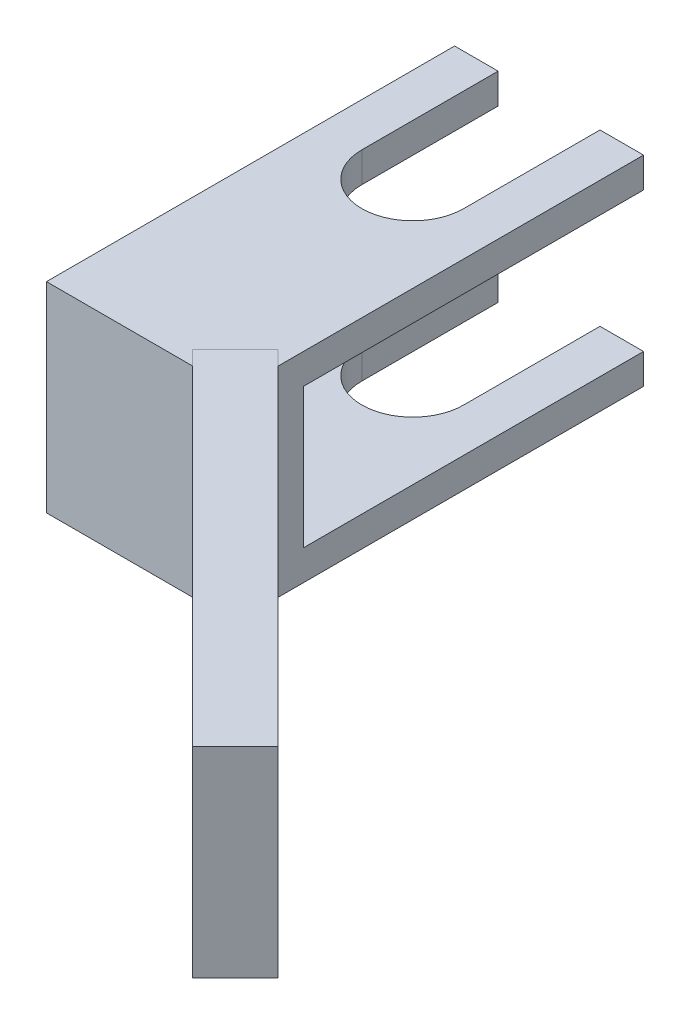
ISO-10303-21;
HEADER;
FILE_DESCRIPTION(('STEP AP214'),'2;1');
FILE_NAME('part.step','',(''),(''),'','','');
FILE_SCHEMA(('AUTOMOTIVE_DESIGN { 1 0 10303 214 1 1 1 1 }'));
ENDSEC;
DATA;
#1=APPLICATION_CONTEXT('core data for automotive mechanical design processes');
#2=APPLICATION_PROTOCOL_DEFINITION('international standard','automotive_design',2000,#1);
#3=PRODUCT_CONTEXT('',#1,'mechanical');
#4=PRODUCT('Part','Part','',(#3));
#5=PRODUCT_RELATED_PRODUCT_CATEGORY('part','',(#4));
#6=PRODUCT_DEFINITION_FORMATION('','',#4);
#7=PRODUCT_DEFINITION_CONTEXT('part definition',#1,'design');
#8=PRODUCT_DEFINITION('design','',#6,#7);
#9=PRODUCT_DEFINITION_SHAPE('','',#8);
#10=(LENGTH_UNIT() NAMED_UNIT(*) SI_UNIT(.MILLI.,.METRE.));
#11=(NAMED_UNIT(*) PLANE_ANGLE_UNIT() SI_UNIT($,.RADIAN.));
#12=(NAMED_UNIT(*) SI_UNIT($,.STERADIAN.) SOLID_ANGLE_UNIT());
#13=UNCERTAINTY_MEASURE_WITH_UNIT(LENGTH_MEASURE(1.E-05),#10,'distance_accuracy_value','');
#14=(GEOMETRIC_REPRESENTATION_CONTEXT(3) GLOBAL_UNCERTAINTY_ASSIGNED_CONTEXT((#13)) GLOBAL_UNIT_ASSIGNED_CONTEXT((#10,
#11,#12)) REPRESENTATION_CONTEXT('',''));
#15=CARTESIAN_POINT('',(0.,0.,0.));
#16=DIRECTION('',(0.,0.,1.));
#17=DIRECTION('',(1.,0.,0.));
#18=AXIS2_PLACEMENT_3D('',#15,#16,#17);
#19=CARTESIAN_POINT('',(34.9307106480413,0.,4.24441914702606));
#20=DIRECTION('',(-0.707106781186548,0.,-0.707106781186547));
#21=DIRECTION('',(-0.707106781186547,0.,0.707106781186548));
#22=AXIS2_PLACEMENT_3D('',#19,#20,#21);
#23=PLANE('',#22);
#24=DIRECTION('',(0.707106781186547,0.,-0.707106781186548));
#25=VECTOR('',#24,1.);
#26=CARTESIAN_POINT('',(34.9307106480413,53.,4.24441914702606));
#27=LINE('',#26,#25);
#28=CARTESIAN_POINT('',(34.9307106480413,53.,4.24441914702606));
#29=VERTEX_POINT('',#28);
#30=CARTESIAN_POINT('',(46.2444191470261,53.,-7.0692893519587));
#31=VERTEX_POINT('',#30);
#32=EDGE_CURVE('E46',#29,#31,#27,.T.);
#33=ORIENTED_EDGE('',*,*,#32,.T.);
#34=DIRECTION('',(0.,1.,0.));
#35=VECTOR('',#34,1.);
#36=CARTESIAN_POINT('',(46.2444191470261,0.,-7.0692893519587));
#37=LINE('',#36,#35);
#38=CARTESIAN_POINT('',(46.2444191470261,0.,-7.0692893519587));
#39=VERTEX_POINT('',#38);
#40=EDGE_CURVE('E83',#39,#31,#37,.T.);
#41=ORIENTED_EDGE('',*,*,#40,.F.);
#42=DIRECTION('',(0.707106781186547,0.,-0.707106781186548));
#43=VECTOR('',#42,1.);
#44=CARTESIAN_POINT('',(34.9307106480413,0.,4.24441914702606));
#45=LINE('',#44,#43);
#46=CARTESIAN_POINT('',(34.9307106480413,0.,4.24441914702606));
#47=VERTEX_POINT('',#46);
#48=EDGE_CURVE('E12',#47,#39,#45,.T.);
#49=ORIENTED_EDGE('',*,*,#48,.F.);
#50=DIRECTION('',(0.,1.,0.));
#51=VECTOR('',#50,1.);
#52=CARTESIAN_POINT('',(34.9307106480413,0.,4.24441914702606));
#53=LINE('',#52,#51);
#54=EDGE_CURVE('E84',#47,#29,#53,.T.);
#55=ORIENTED_EDGE('',*,*,#54,.T.);
#56=EDGE_LOOP('',(#33,#41,#49,#55));
#57=FACE_BOUND('',#56,.T.);
#58=ADVANCED_FACE('F43',(#57),#23,.T.);
#59=CARTESIAN_POINT('',(34.9307106480413,0.,4.24441914702606));
#60=DIRECTION('',(0.,-1.,0.));
#61=DIRECTION('',(0.,0.,-1.));
#62=AXIS2_PLACEMENT_3D('',#59,#60,#61);
#63=PLANE('',#62);
#64=ORIENTED_EDGE('',*,*,#48,.T.);
#65=DIRECTION('',(-0.707106781186547,0.,-0.707106781186547));
#66=VECTOR('',#65,1.);
#67=CARTESIAN_POINT('',(46.2444191470261,0.,-7.0692893519587));
#68=LINE('',#67,#66);
#69=CARTESIAN_POINT('',(137.245815270137,0.,83.9321067711522));
#70=VERTEX_POINT('',#69);
#71=EDGE_CURVE('E100',#70,#39,#68,.T.);
#72=ORIENTED_EDGE('',*,*,#71,.F.);
#73=DIRECTION('',(0.707106781186547,0.,-0.707106781186548));
#74=VECTOR('',#73,1.);
#75=CARTESIAN_POINT('',(125.932106771152,0.,95.245815270137));
#76=LINE('',#75,#74);
#77=CARTESIAN_POINT('',(125.932106771152,0.,95.245815270137));
#78=VERTEX_POINT('',#77);
#79=EDGE_CURVE('E51',#78,#70,#76,.T.);
#80=ORIENTED_EDGE('',*,*,#79,.F.);
#81=DIRECTION('',(-0.707106781186547,0.,-0.707106781186547));
#82=VECTOR('',#81,1.);
#83=CARTESIAN_POINT('',(34.9307106480413,0.,4.24441914702606));
#84=LINE('',#83,#82);
#85=EDGE_CURVE('E89',#78,#47,#84,.T.);
#86=ORIENTED_EDGE('',*,*,#85,.T.);
#87=EDGE_LOOP('',(#64,#72,#80,#86));
#88=FACE_BOUND('',#87,.T.);
#89=ADVANCED_FACE('F115',(#88),#63,.T.);
#90=CARTESIAN_POINT('',(125.932106771152,0.,95.245815270137));
#91=DIRECTION('',(0.707106781186548,0.,0.707106781186547));
#92=DIRECTION('',(0.707106781186547,0.,-0.707106781186548));
#93=AXIS2_PLACEMENT_3D('',#90,#91,#92);
#94=PLANE('',#93);
#95=ORIENTED_EDGE('',*,*,#79,.T.);
#96=DIRECTION('',(0.,-1.,0.));
#97=VECTOR('',#96,1.);
#98=CARTESIAN_POINT('',(137.245815270137,0.,83.9321067711522));
#99=LINE('',#98,#97);
#100=CARTESIAN_POINT('',(137.245815270137,53.,83.9321067711522));
#101=VERTEX_POINT('',#100);
#102=EDGE_CURVE('E96',#101,#70,#99,.T.);
#103=ORIENTED_EDGE('',*,*,#102,.F.);
#104=DIRECTION('',(0.707106781186547,0.,-0.707106781186548));
#105=VECTOR('',#104,1.);
#106=CARTESIAN_POINT('',(125.932106771152,53.,95.245815270137));
#107=LINE('',#106,#105);
#108=CARTESIAN_POINT('',(125.932106771152,53.,95.245815270137));
#109=VERTEX_POINT('',#108);
#110=EDGE_CURVE('E88',#109,#101,#107,.T.);
#111=ORIENTED_EDGE('',*,*,#110,.F.);
#112=DIRECTION('',(0.,-1.,0.));
#113=VECTOR('',#112,1.);
#114=CARTESIAN_POINT('',(125.932106771152,0.,95.245815270137));
#115=LINE('',#114,#113);
#116=EDGE_CURVE('E108',#109,#78,#115,.T.);
#117=ORIENTED_EDGE('',*,*,#116,.T.);
#118=EDGE_LOOP('',(#95,#103,#111,#117));
#119=FACE_BOUND('',#118,.T.);
#120=ADVANCED_FACE('F112',(#119),#94,.T.);
#121=CARTESIAN_POINT('',(34.9307106480413,53.,4.24441914702606));
#122=DIRECTION('',(0.,1.,0.));
#123=DIRECTION('',(0.,0.,1.));
#124=AXIS2_PLACEMENT_3D('',#121,#122,#123);
#125=PLANE('',#124);
#126=ORIENTED_EDGE('',*,*,#110,.T.);
#127=DIRECTION('',(0.707106781186547,0.,0.707106781186547));
#128=VECTOR('',#127,1.);
#129=CARTESIAN_POINT('',(46.2444191470261,53.,-7.0692893519587));
#130=LINE('',#129,#128);
#131=EDGE_CURVE('E91',#31,#101,#130,.T.);
#132=ORIENTED_EDGE('',*,*,#131,.F.);
#133=ORIENTED_EDGE('',*,*,#32,.F.);
#134=DIRECTION('',(0.707106781186547,0.,0.707106781186547));
#135=VECTOR('',#134,1.);
#136=CARTESIAN_POINT('',(34.9307106480413,53.,4.24441914702606));
#137=LINE('',#136,#135);
#138=EDGE_CURVE('E106',#29,#109,#137,.T.);
#139=ORIENTED_EDGE('',*,*,#138,.T.);
#140=EDGE_LOOP('',(#126,#132,#133,#139));
#141=FACE_BOUND('',#140,.T.);
#142=ADVANCED_FACE('F92',(#141),#125,.T.);
#143=CARTESIAN_POINT('',(15.3431457505076,0.,-15.3431457505076));
#144=DIRECTION('',(0.707106781186547,0.,-0.707106781186547));
#145=DIRECTION('',(-0.707106781186548,0.,-0.707106781186548));
#146=AXIS2_PLACEMENT_3D('',#143,#144,#145);
#147=PLANE('',#146);
#148=ORIENTED_EDGE('',*,*,#54,.F.);
#149=ORIENTED_EDGE('',*,*,#85,.F.);
#150=ORIENTED_EDGE('',*,*,#116,.F.);
#151=ORIENTED_EDGE('',*,*,#138,.F.);
#152=EDGE_LOOP('',(#148,#149,#150,#151));
#153=FACE_BOUND('',#152,.T.);
#154=ADVANCED_FACE('F117',(#153),#147,.F.);
#155=CARTESIAN_POINT('',(26.6568542494924,0.,-26.6568542494924));
#156=DIRECTION('',(0.707106781186547,0.,-0.707106781186547));
#157=DIRECTION('',(-0.707106781186548,0.,-0.707106781186548));
#158=AXIS2_PLACEMENT_3D('',#155,#156,#157);
#159=PLANE('',#158);
#160=ORIENTED_EDGE('',*,*,#40,.T.);
#161=ORIENTED_EDGE('',*,*,#131,.T.);
#162=ORIENTED_EDGE('',*,*,#102,.T.);
#163=ORIENTED_EDGE('',*,*,#71,.T.);
#164=EDGE_LOOP('',(#160,#161,#162,#163));
#165=FACE_BOUND('',#164,.T.);
#166=ADVANCED_FACE('F99',(#165),#159,.T.);
#167=CLOSED_SHELL('',(#58,#89,#120,#142,#154,#166));
#168=MANIFOLD_SOLID_BREP('B2',#167);
#169=CARTESIAN_POINT('',(0.,8.,-100.));
#170=DIRECTION('',(0.,0.,1.));
#171=DIRECTION('',(1.,0.,0.));
#172=AXIS2_PLACEMENT_3D('',#169,#170,#171);
#173=PLANE('',#172);
#174=DIRECTION('',(-1.,0.,0.));
#175=VECTOR('',#174,1.);
#176=CARTESIAN_POINT('',(0.,8.,-100.));
#177=LINE('',#176,#175);
#178=CARTESIAN_POINT('',(11.5204483572271,8.,-100.));
#179=VERTEX_POINT('',#178);
#180=CARTESIAN_POINT('',(0.,8.,-100.));
#181=VERTEX_POINT('',#180);
#182=EDGE_CURVE('E414',#179,#181,#177,.T.);
#183=ORIENTED_EDGE('',*,*,#182,.F.);
#184=DIRECTION('',(0.,-1.,0.));
#185=VECTOR('',#184,1.);
#186=CARTESIAN_POINT('',(11.5204483572271,8.,-100.));
#187=LINE('',#186,#185);
#188=CARTESIAN_POINT('',(11.5204483572271,0.,-100.));
#189=VERTEX_POINT('',#188);
#190=EDGE_CURVE('E404',#179,#189,#187,.T.);
#191=ORIENTED_EDGE('',*,*,#190,.T.);
#192=DIRECTION('',(-1.,0.,0.));
#193=VECTOR('',#192,1.);
#194=CARTESIAN_POINT('',(0.,0.,-100.));
#195=LINE('',#194,#193);
#196=CARTESIAN_POINT('',(0.,0.,-100.));
#197=VERTEX_POINT('',#196);
#198=EDGE_CURVE('E422',#189,#197,#195,.T.);
#199=ORIENTED_EDGE('',*,*,#198,.T.);
#200=DIRECTION('',(0.,-1.,0.));
#201=VECTOR('',#200,1.);
#202=CARTESIAN_POINT('',(0.,8.,-100.));
#203=LINE('',#202,#201);
#204=EDGE_CURVE('E418',#181,#197,#203,.T.);
#205=ORIENTED_EDGE('',*,*,#204,.F.);
#206=EDGE_LOOP('',(#183,#191,#199,#205));
#207=FACE_BOUND('',#206,.T.);
#208=ADVANCED_FACE('F167',(#207),#173,.F.);
#209=CARTESIAN_POINT('',(0.,8.,0.));
#210=DIRECTION('',(1.,0.,0.));
#211=DIRECTION('',(0.,0.,-1.));
#212=AXIS2_PLACEMENT_3D('',#209,#210,#211);
#213=PLANE('',#212);
#214=DIRECTION('',(0.,-1.,0.));
#215=VECTOR('',#214,1.);
#216=CARTESIAN_POINT('',(0.,0.,8.));
#217=LINE('',#216,#215);
#218=CARTESIAN_POINT('',(0.,53.,8.));
#219=VERTEX_POINT('',#218);
#220=CARTESIAN_POINT('',(0.,0.,8.));
#221=VERTEX_POINT('',#220);
#222=EDGE_CURVE('E354',#219,#221,#217,.T.);
#223=ORIENTED_EDGE('',*,*,#222,.F.);
#224=DIRECTION('',(0.,0.,1.));
#225=VECTOR('',#224,1.);
#226=CARTESIAN_POINT('',(0.,53.,-10.));
#227=LINE('',#226,#225);
#228=CARTESIAN_POINT('',(0.,53.,-100.));
#229=VERTEX_POINT('',#228);
#230=EDGE_CURVE('E370',#229,#219,#227,.T.);
#231=ORIENTED_EDGE('',*,*,#230,.F.);
#232=DIRECTION('',(0.,-1.,0.));
#233=VECTOR('',#232,1.);
#234=CARTESIAN_POINT('',(0.,53.,-100.));
#235=LINE('',#234,#233);
#236=CARTESIAN_POINT('',(0.,45.,-100.));
#237=VERTEX_POINT('',#236);
#238=EDGE_CURVE('E338',#229,#237,#235,.T.);
#239=ORIENTED_EDGE('',*,*,#238,.T.);
#240=DIRECTION('',(0.,0.,1.));
#241=VECTOR('',#240,1.);
#242=CARTESIAN_POINT('',(0.,45.,0.));
#243=LINE('',#242,#241);
#244=CARTESIAN_POINT('',(0.,45.,-10.));
#245=VERTEX_POINT('',#244);
#246=EDGE_CURVE('E334',#237,#245,#243,.T.);
#247=ORIENTED_EDGE('',*,*,#246,.T.);
#248=DIRECTION('',(0.,-1.,0.));
#249=VECTOR('',#248,1.);
#250=CARTESIAN_POINT('',(0.,0.,-10.));
#251=LINE('',#250,#249);
#252=CARTESIAN_POINT('',(0.,8.,-10.));
#253=VERTEX_POINT('',#252);
#254=EDGE_CURVE('E366',#245,#253,#251,.T.);
#255=ORIENTED_EDGE('',*,*,#254,.T.);
#256=DIRECTION('',(0.,0.,1.));
#257=VECTOR('',#256,1.);
#258=CARTESIAN_POINT('',(0.,8.,0.));
#259=LINE('',#258,#257);
#260=EDGE_CURVE('E408',#181,#253,#259,.T.);
#261=ORIENTED_EDGE('',*,*,#260,.F.);
#262=ORIENTED_EDGE('',*,*,#204,.T.);
#263=DIRECTION('',(0.,0.,1.));
#264=VECTOR('',#263,1.);
#265=CARTESIAN_POINT('',(0.,0.,0.));
#266=LINE('',#265,#264);
#267=EDGE_CURVE('E407',#197,#221,#266,.T.);
#268=ORIENTED_EDGE('',*,*,#267,.T.);
#269=EDGE_LOOP('',(#223,#231,#239,#247,#255,#261,#262,#268));
#270=FACE_BOUND('',#269,.T.);
#271=ADVANCED_FACE('F169',(#270),#213,.F.);
#272=CARTESIAN_POINT('',(50.,8.,0.));
#273=DIRECTION('',(-1.,0.,0.));
#274=DIRECTION('',(0.,0.,1.));
#275=AXIS2_PLACEMENT_3D('',#272,#273,#274);
#276=PLANE('',#275);
#277=DIRECTION('',(0.,0.,1.));
#278=VECTOR('',#277,1.);
#279=CARTESIAN_POINT('',(50.,53.,-10.));
#280=LINE('',#279,#278);
#281=CARTESIAN_POINT('',(50.,53.,-100.));
#282=VERTEX_POINT('',#281);
#283=CARTESIAN_POINT('',(50.,53.,8.));
#284=VERTEX_POINT('',#283);
#285=EDGE_CURVE('E369',#282,#284,#280,.T.);
#286=ORIENTED_EDGE('',*,*,#285,.T.);
#287=DIRECTION('',(0.,1.,0.));
#288=VECTOR('',#287,1.);
#289=CARTESIAN_POINT('',(50.,0.,8.));
#290=LINE('',#289,#288);
#291=CARTESIAN_POINT('',(50.,0.,8.));
#292=VERTEX_POINT('',#291);
#293=EDGE_CURVE('E360',#292,#284,#290,.T.);
#294=ORIENTED_EDGE('',*,*,#293,.F.);
#295=DIRECTION('',(0.,0.,-1.));
#296=VECTOR('',#295,1.);
#297=CARTESIAN_POINT('',(50.,0.,0.));
#298=LINE('',#297,#296);
#299=CARTESIAN_POINT('',(50.,0.,-100.));
#300=VERTEX_POINT('',#299);
#301=EDGE_CURVE('E420',#292,#300,#298,.T.);
#302=ORIENTED_EDGE('',*,*,#301,.T.);
#303=DIRECTION('',(0.,-1.,0.));
#304=VECTOR('',#303,1.);
#305=CARTESIAN_POINT('',(50.,8.,-100.));
#306=LINE('',#305,#304);
#307=CARTESIAN_POINT('',(50.,8.,-100.));
#308=VERTEX_POINT('',#307);
#309=EDGE_CURVE('E427',#308,#300,#306,.T.);
#310=ORIENTED_EDGE('',*,*,#309,.F.);
#311=DIRECTION('',(0.,0.,-1.));
#312=VECTOR('',#311,1.);
#313=CARTESIAN_POINT('',(50.,8.,0.));
#314=LINE('',#313,#312);
#315=CARTESIAN_POINT('',(50.,8.,-10.));
#316=VERTEX_POINT('',#315);
#317=EDGE_CURVE('E411',#316,#308,#314,.T.);
#318=ORIENTED_EDGE('',*,*,#317,.F.);
#319=DIRECTION('',(0.,1.,0.));
#320=VECTOR('',#319,1.);
#321=CARTESIAN_POINT('',(50.,0.,-10.));
#322=LINE('',#321,#320);
#323=CARTESIAN_POINT('',(50.,45.,-10.));
#324=VERTEX_POINT('',#323);
#325=EDGE_CURVE('E184',#316,#324,#322,.T.);
#326=ORIENTED_EDGE('',*,*,#325,.T.);
#327=DIRECTION('',(0.,0.,-1.));
#328=VECTOR('',#327,1.);
#329=CARTESIAN_POINT('',(50.,45.,0.));
#330=LINE('',#329,#328);
#331=CARTESIAN_POINT('',(50.,45.,-100.));
#332=VERTEX_POINT('',#331);
#333=EDGE_CURVE('E342',#324,#332,#330,.T.);
#334=ORIENTED_EDGE('',*,*,#333,.T.);
#335=DIRECTION('',(0.,-1.,0.));
#336=VECTOR('',#335,1.);
#337=CARTESIAN_POINT('',(50.,53.,-100.));
#338=LINE('',#337,#336);
#339=EDGE_CURVE('E350',#282,#332,#338,.T.);
#340=ORIENTED_EDGE('',*,*,#339,.F.);
#341=EDGE_LOOP('',(#286,#294,#302,#310,#318,#326,#334,#340));
#342=FACE_BOUND('',#341,.T.);
#343=ADVANCED_FACE('F465',(#342),#276,.F.);
#344=CARTESIAN_POINT('',(38.479551592322,0.,-100.));
#345=VERTEX_POINT('',#344);
#346=EDGE_CURVE('E412',#300,#345,#195,.T.);
#347=ORIENTED_EDGE('',*,*,#346,.T.);
#348=DIRECTION('',(0.,1.,0.));
#349=VECTOR('',#348,1.);
#350=CARTESIAN_POINT('',(38.479551592322,0.,-100.));
#351=LINE('',#350,#349);
#352=CARTESIAN_POINT('',(38.479551592322,8.,-100.));
#353=VERTEX_POINT('',#352);
#354=EDGE_CURVE('E398',#345,#353,#351,.T.);
#355=ORIENTED_EDGE('',*,*,#354,.T.);
#356=EDGE_CURVE('E415',#308,#353,#177,.T.);
#357=ORIENTED_EDGE('',*,*,#356,.F.);
#358=ORIENTED_EDGE('',*,*,#309,.T.);
#359=EDGE_LOOP('',(#347,#355,#357,#358));
#360=FACE_BOUND('',#359,.T.);
#361=ADVANCED_FACE('F462',(#360),#173,.F.);
#362=CARTESIAN_POINT('',(0.,8.,0.));
#363=DIRECTION('',(0.,-1.,0.));
#364=DIRECTION('',(0.,0.,-1.));
#365=AXIS2_PLACEMENT_3D('',#362,#363,#364);
#366=PLANE('',#365);
#367=ORIENTED_EDGE('',*,*,#260,.T.);
#368=DIRECTION('',(1.,0.,0.));
#369=VECTOR('',#368,1.);
#370=CARTESIAN_POINT('',(0.,8.,-10.));
#371=LINE('',#370,#369);
#372=EDGE_CURVE('E372',#253,#316,#371,.T.);
#373=ORIENTED_EDGE('',*,*,#372,.T.);
#374=ORIENTED_EDGE('',*,*,#317,.T.);
#375=ORIENTED_EDGE('',*,*,#356,.T.);
#376=CARTESIAN_POINT('',(25.,8.,-100.));
#377=DIRECTION('',(0.,1.,0.));
#378=DIRECTION('',(0.,0.,1.));
#379=AXIS2_PLACEMENT_3D('',#376,#377,#378);
#380=CIRCLE('',#379,13.479551592322);
#381=CARTESIAN_POINT('',(38.4795515418711,8.,-99.9988337620739));
#382=VERTEX_POINT('',#381);
#383=EDGE_CURVE('E392',#382,#353,#380,.T.);
#384=ORIENTED_EDGE('',*,*,#383,.F.);
#385=DIRECTION('',(8.6519044650364E-05,0.,-0.999999996257227));
#386=VECTOR('',#385,1.);
#387=CARTESIAN_POINT('',(38.476431566667,8.,-63.9376959515123));
#388=LINE('',#387,#386);
#389=CARTESIAN_POINT('',(38.476431566667,8.,-63.9376959515123));
#390=VERTEX_POINT('',#389);
#391=EDGE_CURVE('E389',#390,#382,#388,.T.);
#392=ORIENTED_EDGE('',*,*,#391,.F.);
#393=CARTESIAN_POINT('',(24.9968800247959,8.,-63.9388621894383));
#394=DIRECTION('',(0.,1.,0.));
#395=DIRECTION('',(0.,0.,1.));
#396=AXIS2_PLACEMENT_3D('',#393,#394,#395);
#397=CIRCLE('',#396,13.479551592322);
#398=CARTESIAN_POINT('',(11.5173284829249,8.,-63.9400284273644));
#399=VERTEX_POINT('',#398);
#400=EDGE_CURVE('E375',#399,#390,#397,.T.);
#401=ORIENTED_EDGE('',*,*,#400,.F.);
#402=DIRECTION('',(-8.65190446501235E-05,0.,0.999999996257227));
#403=VECTOR('',#402,1.);
#404=CARTESIAN_POINT('',(11.5173284829249,8.,-63.9400284273644));
#405=LINE('',#404,#403);
#406=EDGE_CURVE('E380',#179,#399,#405,.T.);
#407=ORIENTED_EDGE('',*,*,#406,.F.);
#408=ORIENTED_EDGE('',*,*,#182,.T.);
#409=EDGE_LOOP('',(#367,#373,#374,#375,#384,#392,#401,#407,#408));
#410=FACE_BOUND('',#409,.T.);
#411=ADVANCED_FACE('F447',(#410),#366,.F.);
#412=CARTESIAN_POINT('',(0.,0.,0.));
#413=DIRECTION('',(0.,-1.,0.));
#414=DIRECTION('',(0.,0.,-1.));
#415=AXIS2_PLACEMENT_3D('',#412,#413,#414);
#416=PLANE('',#415);
#417=ORIENTED_EDGE('',*,*,#346,.F.);
#418=ORIENTED_EDGE('',*,*,#301,.F.);
#419=DIRECTION('',(1.,0.,0.));
#420=VECTOR('',#419,1.);
#421=CARTESIAN_POINT('',(0.,0.,8.));
#422=LINE('',#421,#420);
#423=EDGE_CURVE('E357',#221,#292,#422,.T.);
#424=ORIENTED_EDGE('',*,*,#423,.F.);
#425=ORIENTED_EDGE('',*,*,#267,.F.);
#426=ORIENTED_EDGE('',*,*,#198,.F.);
#427=DIRECTION('',(8.65190446501235E-05,0.,-0.999999996257227));
#428=VECTOR('',#427,1.);
#429=CARTESIAN_POINT('',(11.5117963665577,0.,0.000995989627569095));
#430=LINE('',#429,#428);
#431=CARTESIAN_POINT('',(11.5173284829249,0.,-63.9400284273644));
#432=VERTEX_POINT('',#431);
#433=EDGE_CURVE('E175',#432,#189,#430,.T.);
#434=ORIENTED_EDGE('',*,*,#433,.F.);
#435=CARTESIAN_POINT('',(24.9968800247959,0.,-63.9388621894383));
#436=DIRECTION('',(0.,1.,0.));
#437=DIRECTION('',(0.,0.,1.));
#438=AXIS2_PLACEMENT_3D('',#435,#436,#437);
#439=CIRCLE('',#438,13.479551592322);
#440=CARTESIAN_POINT('',(38.476431566667,0.,-63.9376959515123));
#441=VERTEX_POINT('',#440);
#442=EDGE_CURVE('E376',#432,#441,#439,.T.);
#443=ORIENTED_EDGE('',*,*,#442,.T.);
#444=DIRECTION('',(8.6519044650364E-05,0.,-0.999999996257227));
#445=VECTOR('',#444,1.);
#446=CARTESIAN_POINT('',(38.476431566667,0.,-63.9376959515123));
#447=LINE('',#446,#445);
#448=CARTESIAN_POINT('',(38.4795515418711,0.,-99.9988337620739));
#449=VERTEX_POINT('',#448);
#450=EDGE_CURVE('E379',#441,#449,#447,.T.);
#451=ORIENTED_EDGE('',*,*,#450,.T.);
#452=CARTESIAN_POINT('',(25.,0.,-100.));
#453=DIRECTION('',(0.,1.,0.));
#454=DIRECTION('',(0.,0.,1.));
#455=AXIS2_PLACEMENT_3D('',#452,#453,#454);
#456=CIRCLE('',#455,13.479551592322);
#457=EDGE_CURVE('E383',#449,#345,#456,.T.);
#458=ORIENTED_EDGE('',*,*,#457,.T.);
#459=EDGE_LOOP('',(#417,#418,#424,#425,#426,#434,#443,#451,#458));
#460=FACE_BOUND('',#459,.T.);
#461=ADVANCED_FACE('F441',(#460),#416,.T.);
#462=CARTESIAN_POINT('',(11.5173284829249,0.,-63.9400284273644));
#463=DIRECTION('',(-0.999999996257227,0.,-8.65190446501235E-05));
#464=DIRECTION('',(-8.65190446501235E-05,0.,0.999999996257227));
#465=AXIS2_PLACEMENT_3D('',#462,#463,#464);
#466=PLANE('',#465);
#467=ORIENTED_EDGE('',*,*,#406,.T.);
#468=DIRECTION('',(0.,1.,0.));
#469=VECTOR('',#468,1.);
#470=CARTESIAN_POINT('',(11.5173284829249,0.,-63.9400284273644));
#471=LINE('',#470,#469);
#472=EDGE_CURVE('E395',#432,#399,#471,.T.);
#473=ORIENTED_EDGE('',*,*,#472,.F.);
#474=ORIENTED_EDGE('',*,*,#433,.T.);
#475=ORIENTED_EDGE('',*,*,#190,.F.);
#476=EDGE_LOOP('',(#467,#473,#474,#475));
#477=FACE_BOUND('',#476,.T.);
#478=ADVANCED_FACE('F431',(#477),#466,.F.);
#479=CARTESIAN_POINT('',(25.,0.,-100.));
#480=DIRECTION('',(0.,1.,0.));
#481=DIRECTION('',(0.,0.,1.));
#482=AXIS2_PLACEMENT_3D('',#479,#480,#481);
#483=CYLINDRICAL_SURFACE('',#482,13.479551592322);
#484=ORIENTED_EDGE('',*,*,#457,.F.);
#485=DIRECTION('',(0.,1.,0.));
#486=VECTOR('',#485,1.);
#487=CARTESIAN_POINT('',(38.4795515418711,0.,-99.9988337620739));
#488=LINE('',#487,#486);
#489=EDGE_CURVE('E399',#449,#382,#488,.T.);
#490=ORIENTED_EDGE('',*,*,#489,.T.);
#491=ORIENTED_EDGE('',*,*,#383,.T.);
#492=ORIENTED_EDGE('',*,*,#354,.F.);
#493=EDGE_LOOP('',(#484,#490,#491,#492));
#494=FACE_BOUND('',#493,.T.);
#495=ADVANCED_FACE('F459',(#494),#483,.F.);
#496=CARTESIAN_POINT('',(24.9968800247959,0.,-63.9388621894383));
#497=DIRECTION('',(0.,1.,0.));
#498=DIRECTION('',(0.,0.,1.));
#499=AXIS2_PLACEMENT_3D('',#496,#497,#498);
#500=CYLINDRICAL_SURFACE('',#499,13.479551592322);
#501=ORIENTED_EDGE('',*,*,#400,.T.);
#502=DIRECTION('',(0.,1.,0.));
#503=VECTOR('',#502,1.);
#504=CARTESIAN_POINT('',(38.476431566667,0.,-63.9376959515123));
#505=LINE('',#504,#503);
#506=EDGE_CURVE('E386',#441,#390,#505,.T.);
#507=ORIENTED_EDGE('',*,*,#506,.F.);
#508=ORIENTED_EDGE('',*,*,#442,.F.);
#509=ORIENTED_EDGE('',*,*,#472,.T.);
#510=EDGE_LOOP('',(#501,#507,#508,#509));
#511=FACE_BOUND('',#510,.T.);
#512=ADVANCED_FACE('F452',(#511),#500,.F.);
#513=CARTESIAN_POINT('',(38.476431566667,0.,-63.9376959515123));
#514=DIRECTION('',(0.999999996257227,0.,8.6519044650364E-05));
#515=DIRECTION('',(8.6519044650364E-05,0.,-0.999999996257227));
#516=AXIS2_PLACEMENT_3D('',#513,#514,#515);
#517=PLANE('',#516);
#518=ORIENTED_EDGE('',*,*,#391,.T.);
#519=ORIENTED_EDGE('',*,*,#489,.F.);
#520=ORIENTED_EDGE('',*,*,#450,.F.);
#521=ORIENTED_EDGE('',*,*,#506,.T.);
#522=EDGE_LOOP('',(#518,#519,#520,#521));
#523=FACE_BOUND('',#522,.T.);
#524=ADVANCED_FACE('F456',(#523),#517,.F.);
#525=CARTESIAN_POINT('',(0.,0.,-10.));
#526=DIRECTION('',(0.,0.,-1.));
#527=DIRECTION('',(-1.,0.,0.));
#528=AXIS2_PLACEMENT_3D('',#525,#526,#527);
#529=PLANE('',#528);
#530=DIRECTION('',(-1.,0.,0.));
#531=VECTOR('',#530,1.);
#532=CARTESIAN_POINT('',(0.,45.,-10.));
#533=LINE('',#532,#531);
#534=EDGE_CURVE('E41',#324,#245,#533,.T.);
#535=ORIENTED_EDGE('',*,*,#534,.F.);
#536=ORIENTED_EDGE('',*,*,#325,.F.);
#537=ORIENTED_EDGE('',*,*,#372,.F.);
#538=ORIENTED_EDGE('',*,*,#254,.F.);
#539=EDGE_LOOP('',(#535,#536,#537,#538));
#540=FACE_BOUND('',#539,.T.);
#541=ADVANCED_FACE('F526',(#540),#529,.T.);
#542=CARTESIAN_POINT('',(0.,53.,-10.));
#543=DIRECTION('',(0.,1.,0.));
#544=DIRECTION('',(0.,0.,1.));
#545=AXIS2_PLACEMENT_3D('',#542,#543,#544);
#546=PLANE('',#545);
#547=ORIENTED_EDGE('',*,*,#230,.T.);
#548=DIRECTION('',(-1.,0.,0.));
#549=VECTOR('',#548,1.);
#550=CARTESIAN_POINT('',(0.,53.,8.));
#551=LINE('',#550,#549);
#552=EDGE_CURVE('E363',#284,#219,#551,.T.);
#553=ORIENTED_EDGE('',*,*,#552,.F.);
#554=ORIENTED_EDGE('',*,*,#285,.F.);
#555=DIRECTION('',(-1.,0.,0.));
#556=VECTOR('',#555,1.);
#557=CARTESIAN_POINT('',(0.,53.,-100.));
#558=LINE('',#557,#556);
#559=CARTESIAN_POINT('',(38.479551592322,53.,-100.));
#560=VERTEX_POINT('',#559);
#561=EDGE_CURVE('E335',#282,#560,#558,.T.);
#562=ORIENTED_EDGE('',*,*,#561,.T.);
#563=CARTESIAN_POINT('',(25.,53.,-100.));
#564=DIRECTION('',(0.,1.,0.));
#565=DIRECTION('',(0.,0.,1.));
#566=AXIS2_PLACEMENT_3D('',#563,#564,#565);
#567=CIRCLE('',#566,13.479551592322);
#568=CARTESIAN_POINT('',(38.4795515418711,53.,-99.9988337620739));
#569=VERTEX_POINT('',#568);
#570=EDGE_CURVE('E317',#569,#560,#567,.T.);
#571=ORIENTED_EDGE('',*,*,#570,.F.);
#572=DIRECTION('',(8.6519044650364E-05,0.,-0.999999996257227));
#573=VECTOR('',#572,1.);
#574=CARTESIAN_POINT('',(38.476431566667,53.,-63.9376959515123));
#575=LINE('',#574,#573);
#576=CARTESIAN_POINT('',(38.476431566667,53.,-63.9376959515123));
#577=VERTEX_POINT('',#576);
#578=EDGE_CURVE('E322',#577,#569,#575,.T.);
#579=ORIENTED_EDGE('',*,*,#578,.F.);
#580=CARTESIAN_POINT('',(24.9968800247959,53.,-63.9388621894383));
#581=DIRECTION('',(0.,1.,0.));
#582=DIRECTION('',(0.,0.,1.));
#583=AXIS2_PLACEMENT_3D('',#580,#581,#582);
#584=CIRCLE('',#583,13.479551592322);
#585=CARTESIAN_POINT('',(11.5173284829249,53.,-63.9400284273644));
#586=VERTEX_POINT('',#585);
#587=EDGE_CURVE('E297',#586,#577,#584,.T.);
#588=ORIENTED_EDGE('',*,*,#587,.F.);
#589=DIRECTION('',(-8.65190446501235E-05,0.,0.999999996257227));
#590=VECTOR('',#589,1.);
#591=CARTESIAN_POINT('',(11.5173284829249,53.,-63.9400284273644));
#592=LINE('',#591,#590);
#593=CARTESIAN_POINT('',(11.5204483572271,53.,-100.));
#594=VERTEX_POINT('',#593);
#595=EDGE_CURVE('E315',#594,#586,#592,.T.);
#596=ORIENTED_EDGE('',*,*,#595,.F.);
#597=EDGE_CURVE('E339',#594,#229,#558,.T.);
#598=ORIENTED_EDGE('',*,*,#597,.T.);
#599=EDGE_LOOP('',(#547,#553,#554,#562,#571,#579,#588,#596,#598));
#600=FACE_BOUND('',#599,.T.);
#601=ADVANCED_FACE('F473',(#600),#546,.T.);
#602=CARTESIAN_POINT('',(0.,0.,8.));
#603=DIRECTION('',(0.,0.,-1.));
#604=DIRECTION('',(-1.,0.,0.));
#605=AXIS2_PLACEMENT_3D('',#602,#603,#604);
#606=PLANE('',#605);
#607=ORIENTED_EDGE('',*,*,#222,.T.);
#608=ORIENTED_EDGE('',*,*,#423,.T.);
#609=ORIENTED_EDGE('',*,*,#293,.T.);
#610=ORIENTED_EDGE('',*,*,#552,.T.);
#611=EDGE_LOOP('',(#607,#608,#609,#610));
#612=FACE_BOUND('',#611,.T.);
#613=ADVANCED_FACE('F468',(#612),#606,.F.);
#614=CARTESIAN_POINT('',(0.,53.,-100.));
#615=DIRECTION('',(0.,0.,1.));
#616=DIRECTION('',(1.,0.,0.));
#617=AXIS2_PLACEMENT_3D('',#614,#615,#616);
#618=PLANE('',#617);
#619=ORIENTED_EDGE('',*,*,#597,.F.);
#620=DIRECTION('',(0.,-1.,0.));
#621=VECTOR('',#620,1.);
#622=CARTESIAN_POINT('',(11.5204483572271,53.,-100.));
#623=LINE('',#622,#621);
#624=CARTESIAN_POINT('',(11.5204483572271,45.,-100.));
#625=VERTEX_POINT('',#624);
#626=EDGE_CURVE('E331',#594,#625,#623,.T.);
#627=ORIENTED_EDGE('',*,*,#626,.T.);
#628=DIRECTION('',(-1.,0.,0.));
#629=VECTOR('',#628,1.);
#630=CARTESIAN_POINT('',(0.,45.,-100.));
#631=LINE('',#630,#629);
#632=EDGE_CURVE('E344',#625,#237,#631,.T.);
#633=ORIENTED_EDGE('',*,*,#632,.T.);
#634=ORIENTED_EDGE('',*,*,#238,.F.);
#635=EDGE_LOOP('',(#619,#627,#633,#634));
#636=FACE_BOUND('',#635,.T.);
#637=ADVANCED_FACE('F487',(#636),#618,.F.);
#638=CARTESIAN_POINT('',(38.479551592322,45.,-100.));
#639=VERTEX_POINT('',#638);
#640=EDGE_CURVE('E345',#332,#639,#631,.T.);
#641=ORIENTED_EDGE('',*,*,#640,.T.);
#642=DIRECTION('',(0.,1.,0.));
#643=VECTOR('',#642,1.);
#644=CARTESIAN_POINT('',(38.479551592322,45.,-100.));
#645=LINE('',#644,#643);
#646=EDGE_CURVE('E327',#639,#560,#645,.T.);
#647=ORIENTED_EDGE('',*,*,#646,.T.);
#648=ORIENTED_EDGE('',*,*,#561,.F.);
#649=ORIENTED_EDGE('',*,*,#339,.T.);
#650=EDGE_LOOP('',(#641,#647,#648,#649));
#651=FACE_BOUND('',#650,.T.);
#652=ADVANCED_FACE('F483',(#651),#618,.F.);
#653=CARTESIAN_POINT('',(0.,45.,0.));
#654=DIRECTION('',(0.,-1.,0.));
#655=DIRECTION('',(0.,0.,-1.));
#656=AXIS2_PLACEMENT_3D('',#653,#654,#655);
#657=PLANE('',#656);
#658=ORIENTED_EDGE('',*,*,#333,.F.);
#659=ORIENTED_EDGE('',*,*,#534,.T.);
#660=ORIENTED_EDGE('',*,*,#246,.F.);
#661=ORIENTED_EDGE('',*,*,#632,.F.);
#662=DIRECTION('',(8.65190446501235E-05,0.,-0.999999996257227));
#663=VECTOR('',#662,1.);
#664=CARTESIAN_POINT('',(11.5117963665577,45.,0.000995989627569095));
#665=LINE('',#664,#663);
#666=CARTESIAN_POINT('',(11.5173284829249,45.,-63.9400284273644));
#667=VERTEX_POINT('',#666);
#668=EDGE_CURVE('E314',#667,#625,#665,.T.);
#669=ORIENTED_EDGE('',*,*,#668,.F.);
#670=CARTESIAN_POINT('',(24.9968800247959,45.,-63.9388621894383));
#671=DIRECTION('',(0.,1.,0.));
#672=DIRECTION('',(0.,0.,1.));
#673=AXIS2_PLACEMENT_3D('',#670,#671,#672);
#674=CIRCLE('',#673,13.479551592322);
#675=CARTESIAN_POINT('',(38.476431566667,45.,-63.9376959515123));
#676=VERTEX_POINT('',#675);
#677=EDGE_CURVE('E294',#667,#676,#674,.T.);
#678=ORIENTED_EDGE('',*,*,#677,.T.);
#679=DIRECTION('',(8.6519044650364E-05,0.,-0.999999996257227));
#680=VECTOR('',#679,1.);
#681=CARTESIAN_POINT('',(38.476431566667,45.,-63.9376959515123));
#682=LINE('',#681,#680);
#683=CARTESIAN_POINT('',(38.4795515418711,45.,-99.9988337620739));
#684=VERTEX_POINT('',#683);
#685=EDGE_CURVE('E306',#676,#684,#682,.T.);
#686=ORIENTED_EDGE('',*,*,#685,.T.);
#687=CARTESIAN_POINT('',(25.,45.,-100.));
#688=DIRECTION('',(0.,1.,0.));
#689=DIRECTION('',(0.,0.,1.));
#690=AXIS2_PLACEMENT_3D('',#687,#688,#689);
#691=CIRCLE('',#690,13.479551592322);
#692=EDGE_CURVE('E302',#684,#639,#691,.T.);
#693=ORIENTED_EDGE('',*,*,#692,.T.);
#694=ORIENTED_EDGE('',*,*,#640,.F.);
#695=EDGE_LOOP('',(#658,#659,#660,#661,#669,#678,#686,#693,#694));
#696=FACE_BOUND('',#695,.T.);
#697=ADVANCED_FACE('F312',(#696),#657,.T.);
#698=CARTESIAN_POINT('',(11.5173284829249,45.,-63.9400284273644));
#699=DIRECTION('',(-0.999999996257227,0.,-8.65190446501235E-05));
#700=DIRECTION('',(-8.65190446501235E-05,0.,0.999999996257227));
#701=AXIS2_PLACEMENT_3D('',#698,#699,#700);
#702=PLANE('',#701);
#703=ORIENTED_EDGE('',*,*,#595,.T.);
#704=DIRECTION('',(0.,1.,0.));
#705=VECTOR('',#704,1.);
#706=CARTESIAN_POINT('',(11.5173284829249,45.,-63.9400284273644));
#707=LINE('',#706,#705);
#708=EDGE_CURVE('E325',#667,#586,#707,.T.);
#709=ORIENTED_EDGE('',*,*,#708,.F.);
#710=ORIENTED_EDGE('',*,*,#668,.T.);
#711=ORIENTED_EDGE('',*,*,#626,.F.);
#712=EDGE_LOOP('',(#703,#709,#710,#711));
#713=FACE_BOUND('',#712,.T.);
#714=ADVANCED_FACE('F488',(#713),#702,.F.);
#715=CARTESIAN_POINT('',(25.,45.,-100.));
#716=DIRECTION('',(0.,1.,0.));
#717=DIRECTION('',(0.,0.,1.));
#718=AXIS2_PLACEMENT_3D('',#715,#716,#717);
#719=CYLINDRICAL_SURFACE('',#718,13.479551592322);
#720=ORIENTED_EDGE('',*,*,#692,.F.);
#721=DIRECTION('',(0.,1.,0.));
#722=VECTOR('',#721,1.);
#723=CARTESIAN_POINT('',(38.4795515418711,45.,-99.9988337620739));
#724=LINE('',#723,#722);
#725=EDGE_CURVE('E301',#684,#569,#724,.T.);
#726=ORIENTED_EDGE('',*,*,#725,.T.);
#727=ORIENTED_EDGE('',*,*,#570,.T.);
#728=ORIENTED_EDGE('',*,*,#646,.F.);
#729=EDGE_LOOP('',(#720,#726,#727,#728));
#730=FACE_BOUND('',#729,.T.);
#731=ADVANCED_FACE('F485',(#730),#719,.F.);
#732=CARTESIAN_POINT('',(24.9968800247959,45.,-63.9388621894383));
#733=DIRECTION('',(0.,1.,0.));
#734=DIRECTION('',(0.,0.,1.));
#735=AXIS2_PLACEMENT_3D('',#732,#733,#734);
#736=CYLINDRICAL_SURFACE('',#735,13.479551592322);
#737=ORIENTED_EDGE('',*,*,#587,.T.);
#738=DIRECTION('',(0.,1.,0.));
#739=VECTOR('',#738,1.);
#740=CARTESIAN_POINT('',(38.476431566667,45.,-63.9376959515123));
#741=LINE('',#740,#739);
#742=EDGE_CURVE('E289',#676,#577,#741,.T.);
#743=ORIENTED_EDGE('',*,*,#742,.F.);
#744=ORIENTED_EDGE('',*,*,#677,.F.);
#745=ORIENTED_EDGE('',*,*,#708,.T.);
#746=EDGE_LOOP('',(#737,#743,#744,#745));
#747=FACE_BOUND('',#746,.T.);
#748=ADVANCED_FACE('F291',(#747),#736,.F.);
#749=CARTESIAN_POINT('',(38.476431566667,45.,-63.9376959515123));
#750=DIRECTION('',(0.999999996257227,0.,8.6519044650364E-05));
#751=DIRECTION('',(8.6519044650364E-05,0.,-0.999999996257227));
#752=AXIS2_PLACEMENT_3D('',#749,#750,#751);
#753=PLANE('',#752);
#754=ORIENTED_EDGE('',*,*,#578,.T.);
#755=ORIENTED_EDGE('',*,*,#725,.F.);
#756=ORIENTED_EDGE('',*,*,#685,.F.);
#757=ORIENTED_EDGE('',*,*,#742,.T.);
#758=EDGE_LOOP('',(#754,#755,#756,#757));
#759=FACE_BOUND('',#758,.T.);
#760=ADVANCED_FACE('F307',(#759),#753,.F.);
#761=CLOSED_SHELL('',(#208,#271,#343,#361,#411,#461,#478,#495,#512,#524,#541,#601,#613,#637,
#652,#697,#714,#731,#748,#760));
#762=MANIFOLD_SOLID_BREP('B6',#761);
#763=ADVANCED_BREP_SHAPE_REPRESENTATION('',(#18,#168,#762),#14);
#764=SHAPE_DEFINITION_REPRESENTATION(#9,#763);
ENDSEC;
END-ISO-10303-21;
